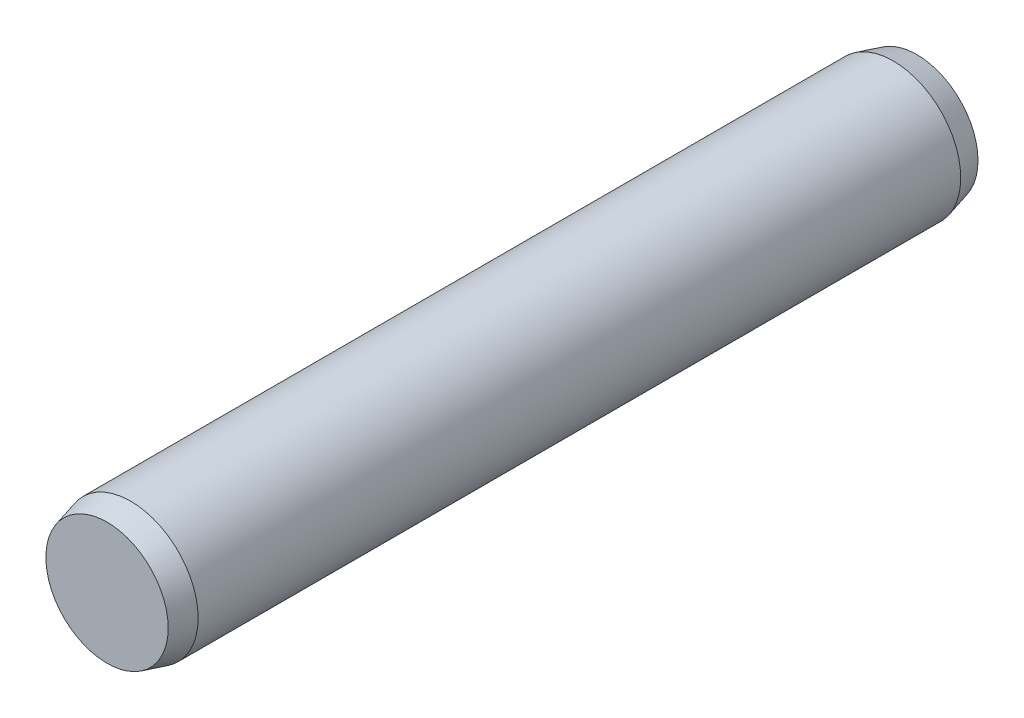
ISO-10303-21;
HEADER;
FILE_DESCRIPTION(('STEP AP214'),'2;1');
FILE_NAME('part.step','',(''),(''),'','','');
FILE_SCHEMA(('AUTOMOTIVE_DESIGN { 1 0 10303 214 1 1 1 1 }'));
ENDSEC;
DATA;
#1=APPLICATION_CONTEXT('core data for automotive mechanical design processes');
#2=APPLICATION_PROTOCOL_DEFINITION('international standard','automotive_design',2000,#1);
#3=PRODUCT_CONTEXT('',#1,'mechanical');
#4=PRODUCT('Part','Part','',(#3));
#5=PRODUCT_RELATED_PRODUCT_CATEGORY('part','',(#4));
#6=PRODUCT_DEFINITION_FORMATION('','',#4);
#7=PRODUCT_DEFINITION_CONTEXT('part definition',#1,'design');
#8=PRODUCT_DEFINITION('design','',#6,#7);
#9=PRODUCT_DEFINITION_SHAPE('','',#8);
#10=(LENGTH_UNIT() NAMED_UNIT(*) SI_UNIT(.MILLI.,.METRE.));
#11=(NAMED_UNIT(*) PLANE_ANGLE_UNIT() SI_UNIT($,.RADIAN.));
#12=(NAMED_UNIT(*) SI_UNIT($,.STERADIAN.) SOLID_ANGLE_UNIT());
#13=UNCERTAINTY_MEASURE_WITH_UNIT(LENGTH_MEASURE(1.E-05),#10,'distance_accuracy_value','');
#14=(GEOMETRIC_REPRESENTATION_CONTEXT(3) GLOBAL_UNCERTAINTY_ASSIGNED_CONTEXT((#13)) GLOBAL_UNIT_ASSIGNED_CONTEXT((#10,
#11,#12)) REPRESENTATION_CONTEXT('',''));
#15=CARTESIAN_POINT('',(0.,0.,0.));
#16=DIRECTION('',(0.,0.,1.));
#17=DIRECTION('',(1.,0.,0.));
#18=AXIS2_PLACEMENT_3D('',#15,#16,#17);
#19=CARTESIAN_POINT('',(0.,0.,5.65));
#20=DIRECTION('',(0.,0.,-1.));
#21=DIRECTION('',(-1.,0.,0.));
#22=AXIS2_PLACEMENT_3D('',#19,#20,#21);
#23=CONICAL_SURFACE('',#22,1.,0.261799387799149);
#24=CARTESIAN_POINT('',(0.,0.,6.));
#25=DIRECTION('',(0.,0.,1.));
#26=DIRECTION('',(1.,0.,0.));
#27=AXIS2_PLACEMENT_3D('',#24,#25,#26);
#28=CIRCLE('',#27,0.906217782649107);
#29=CARTESIAN_POINT('',(0.906217782649107,0.,6.));
#30=VERTEX_POINT('',#29);
#31=EDGE_CURVE('E51',#30,#30,#28,.T.);
#32=ORIENTED_EDGE('',*,*,#31,.F.);
#33=EDGE_LOOP('',(#32));
#34=FACE_BOUND('',#33,.T.);
#35=CARTESIAN_POINT('',(0.,0.,5.65));
#36=DIRECTION('',(0.,0.,1.));
#37=DIRECTION('',(1.,0.,0.));
#38=AXIS2_PLACEMENT_3D('',#35,#36,#37);
#39=CIRCLE('',#38,1.);
#40=CARTESIAN_POINT('',(1.,0.,5.65));
#41=VERTEX_POINT('',#40);
#42=EDGE_CURVE('E10',#41,#41,#39,.T.);
#43=ORIENTED_EDGE('',*,*,#42,.T.);
#44=EDGE_LOOP('',(#43));
#45=FACE_BOUND('',#44,.T.);
#46=ADVANCED_FACE('F37',(#34,#45),#23,.T.);
#47=CARTESIAN_POINT('',(0.,0.,6.));
#48=DIRECTION('',(0.,0.,1.));
#49=DIRECTION('',(1.,0.,0.));
#50=AXIS2_PLACEMENT_3D('',#47,#48,#49);
#51=CYLINDRICAL_SURFACE('',#50,1.);
#52=ORIENTED_EDGE('',*,*,#42,.F.);
#53=EDGE_LOOP('',(#52));
#54=FACE_BOUND('',#53,.T.);
#55=CARTESIAN_POINT('',(0.,0.,-5.65));
#56=DIRECTION('',(0.,0.,1.));
#57=DIRECTION('',(1.,0.,0.));
#58=AXIS2_PLACEMENT_3D('',#55,#56,#57);
#59=CIRCLE('',#58,1.);
#60=CARTESIAN_POINT('',(1.,0.,-5.65));
#61=VERTEX_POINT('',#60);
#62=EDGE_CURVE('E43',#61,#61,#59,.T.);
#63=ORIENTED_EDGE('',*,*,#62,.T.);
#64=EDGE_LOOP('',(#63));
#65=FACE_BOUND('',#64,.T.);
#66=ADVANCED_FACE('F60',(#54,#65),#51,.T.);
#67=CARTESIAN_POINT('',(0.,0.,-6.));
#68=DIRECTION('',(0.,0.,1.));
#69=DIRECTION('',(1.,0.,0.));
#70=AXIS2_PLACEMENT_3D('',#67,#68,#69);
#71=CONICAL_SURFACE('',#70,0.906217782649107,0.261799387799149);
#72=ORIENTED_EDGE('',*,*,#62,.F.);
#73=EDGE_LOOP('',(#72));
#74=FACE_BOUND('',#73,.T.);
#75=CARTESIAN_POINT('',(0.,0.,-6.));
#76=DIRECTION('',(0.,0.,1.));
#77=DIRECTION('',(1.,0.,0.));
#78=AXIS2_PLACEMENT_3D('',#75,#76,#77);
#79=CIRCLE('',#78,0.906217782649107);
#80=CARTESIAN_POINT('',(0.906217782649107,0.,-6.));
#81=VERTEX_POINT('',#80);
#82=EDGE_CURVE('E47',#81,#81,#79,.T.);
#83=ORIENTED_EDGE('',*,*,#82,.T.);
#84=EDGE_LOOP('',(#83));
#85=FACE_BOUND('',#84,.T.);
#86=ADVANCED_FACE('F64',(#74,#85),#71,.T.);
#87=CARTESIAN_POINT('',(0.,0.906217782649107,-6.));
#88=DIRECTION('',(0.,0.,1.));
#89=DIRECTION('',(1.,0.,0.));
#90=AXIS2_PLACEMENT_3D('',#87,#88,#89);
#91=PLANE('',#90);
#92=ORIENTED_EDGE('',*,*,#82,.F.);
#93=EDGE_LOOP('',(#92));
#94=FACE_BOUND('',#93,.T.);
#95=ADVANCED_FACE('F69',(#94),#91,.F.);
#96=CARTESIAN_POINT('',(0.,0.,6.));
#97=DIRECTION('',(0.,0.,-1.));
#98=DIRECTION('',(-1.,0.,0.));
#99=AXIS2_PLACEMENT_3D('',#96,#97,#98);
#100=PLANE('',#99);
#101=ORIENTED_EDGE('',*,*,#31,.T.);
#102=EDGE_LOOP('',(#101));
#103=FACE_BOUND('',#102,.T.);
#104=ADVANCED_FACE('F57',(#103),#100,.F.);
#105=CLOSED_SHELL('',(#46,#66,#86,#95,#104));
#106=MANIFOLD_SOLID_BREP('B2',#105);
#107=ADVANCED_BREP_SHAPE_REPRESENTATION('',(#18,#106),#14);
#108=SHAPE_DEFINITION_REPRESENTATION(#9,#107);
ENDSEC;
END-ISO-10303-21;
